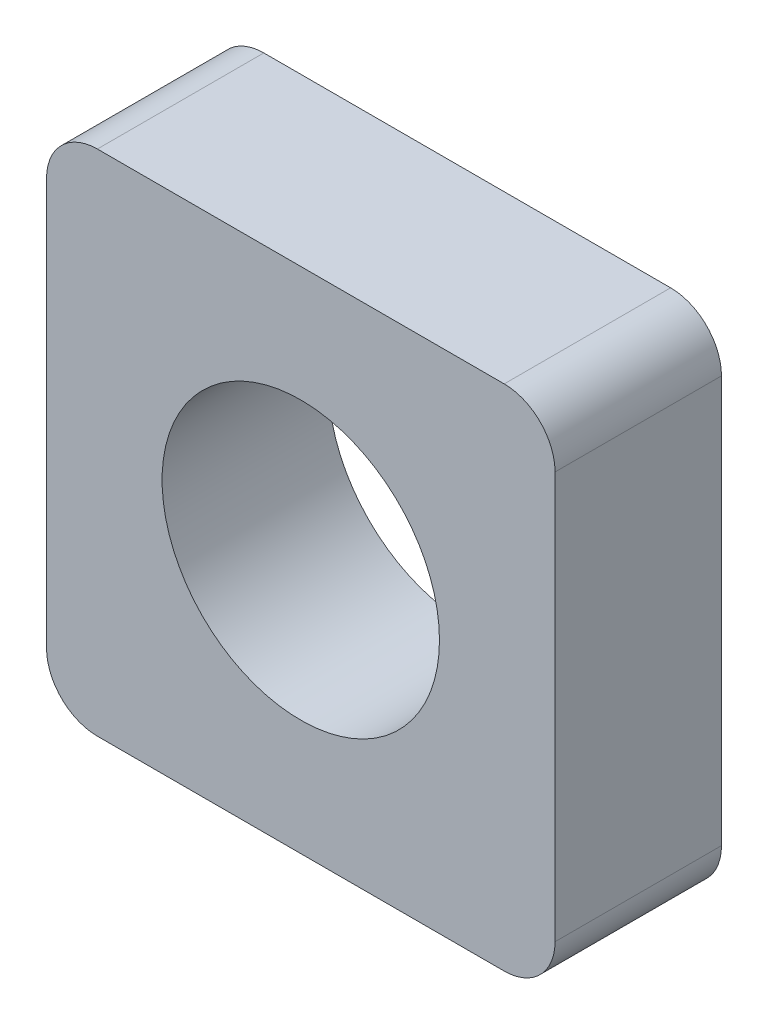
ISO-10303-21;
HEADER;
FILE_DESCRIPTION(('STEP AP214'),'2;1');
FILE_NAME('part.step','',(''),(''),'','','');
FILE_SCHEMA(('AUTOMOTIVE_DESIGN { 1 0 10303 214 1 1 1 1 }'));
ENDSEC;
DATA;
#1=APPLICATION_CONTEXT('core data for automotive mechanical design processes');
#2=APPLICATION_PROTOCOL_DEFINITION('international standard','automotive_design',2000,#1);
#3=PRODUCT_CONTEXT('',#1,'mechanical');
#4=PRODUCT('Part','Part','',(#3));
#5=PRODUCT_RELATED_PRODUCT_CATEGORY('part','',(#4));
#6=PRODUCT_DEFINITION_FORMATION('','',#4);
#7=PRODUCT_DEFINITION_CONTEXT('part definition',#1,'design');
#8=PRODUCT_DEFINITION('design','',#6,#7);
#9=PRODUCT_DEFINITION_SHAPE('','',#8);
#10=(LENGTH_UNIT() NAMED_UNIT(*) SI_UNIT(.MILLI.,.METRE.));
#11=(NAMED_UNIT(*) PLANE_ANGLE_UNIT() SI_UNIT($,.RADIAN.));
#12=(NAMED_UNIT(*) SI_UNIT($,.STERADIAN.) SOLID_ANGLE_UNIT());
#13=UNCERTAINTY_MEASURE_WITH_UNIT(LENGTH_MEASURE(1.E-05),#10,'distance_accuracy_value','');
#14=(GEOMETRIC_REPRESENTATION_CONTEXT(3) GLOBAL_UNCERTAINTY_ASSIGNED_CONTEXT((#13)) GLOBAL_UNIT_ASSIGNED_CONTEXT((#10,
#11,#12)) REPRESENTATION_CONTEXT('',''));
#15=CARTESIAN_POINT('',(0.,0.,0.));
#16=DIRECTION('',(0.,0.,1.));
#17=DIRECTION('',(1.,0.,0.));
#18=AXIS2_PLACEMENT_3D('',#15,#16,#17);
#19=CARTESIAN_POINT('',(0.,0.,1.8));
#20=DIRECTION('',(0.,0.,1.));
#21=DIRECTION('',(1.,0.,0.));
#22=AXIS2_PLACEMENT_3D('',#19,#20,#21);
#23=PLANE('',#22);
#24=DIRECTION('',(0.,-1.,0.));
#25=VECTOR('',#24,1.);
#26=CARTESIAN_POINT('',(-2.75,2.75,1.8));
#27=LINE('',#26,#25);
#28=CARTESIAN_POINT('',(-2.75,2.2,1.8));
#29=VERTEX_POINT('',#28);
#30=CARTESIAN_POINT('',(-2.75,-2.2,1.8));
#31=VERTEX_POINT('',#30);
#32=EDGE_CURVE('E165',#29,#31,#27,.T.);
#33=ORIENTED_EDGE('',*,*,#32,.T.);
#34=CARTESIAN_POINT('',(-2.2,-2.2,1.8));
#35=DIRECTION('',(0.,0.,1.));
#36=DIRECTION('',(1.,0.,0.));
#37=AXIS2_PLACEMENT_3D('',#34,#35,#36);
#38=CIRCLE('',#37,0.55);
#39=CARTESIAN_POINT('',(-2.2,-2.75,1.8));
#40=VERTEX_POINT('',#39);
#41=EDGE_CURVE('E148',#31,#40,#38,.T.);
#42=ORIENTED_EDGE('',*,*,#41,.T.);
#43=DIRECTION('',(1.,0.,0.));
#44=VECTOR('',#43,1.);
#45=CARTESIAN_POINT('',(-2.75,-2.75,1.8));
#46=LINE('',#45,#44);
#47=CARTESIAN_POINT('',(2.2,-2.75,1.8));
#48=VERTEX_POINT('',#47);
#49=EDGE_CURVE('E119',#40,#48,#46,.T.);
#50=ORIENTED_EDGE('',*,*,#49,.T.);
#51=CARTESIAN_POINT('',(2.2,-2.2,1.8));
#52=DIRECTION('',(0.,0.,1.));
#53=DIRECTION('',(1.,0.,0.));
#54=AXIS2_PLACEMENT_3D('',#51,#52,#53);
#55=CIRCLE('',#54,0.55);
#56=CARTESIAN_POINT('',(2.75,-2.2,1.8));
#57=VERTEX_POINT('',#56);
#58=EDGE_CURVE('E146',#48,#57,#55,.T.);
#59=ORIENTED_EDGE('',*,*,#58,.T.);
#60=DIRECTION('',(0.,1.,0.));
#61=VECTOR('',#60,1.);
#62=CARTESIAN_POINT('',(2.75,2.75,1.8));
#63=LINE('',#62,#61);
#64=CARTESIAN_POINT('',(2.75,2.2,1.8));
#65=VERTEX_POINT('',#64);
#66=EDGE_CURVE('E126',#57,#65,#63,.T.);
#67=ORIENTED_EDGE('',*,*,#66,.T.);
#68=CARTESIAN_POINT('',(2.2,2.2,1.8));
#69=DIRECTION('',(0.,0.,1.));
#70=DIRECTION('',(1.,0.,0.));
#71=AXIS2_PLACEMENT_3D('',#68,#69,#70);
#72=CIRCLE('',#71,0.55);
#73=CARTESIAN_POINT('',(2.2,2.75,1.8));
#74=VERTEX_POINT('',#73);
#75=EDGE_CURVE('E54',#65,#74,#72,.T.);
#76=ORIENTED_EDGE('',*,*,#75,.T.);
#77=DIRECTION('',(-1.,0.,0.));
#78=VECTOR('',#77,1.);
#79=CARTESIAN_POINT('',(-2.75,2.75,1.8));
#80=LINE('',#79,#78);
#81=CARTESIAN_POINT('',(-2.2,2.75,1.8));
#82=VERTEX_POINT('',#81);
#83=EDGE_CURVE('E129',#74,#82,#80,.T.);
#84=ORIENTED_EDGE('',*,*,#83,.T.);
#85=CARTESIAN_POINT('',(-2.2,2.2,1.8));
#86=DIRECTION('',(0.,0.,1.));
#87=DIRECTION('',(1.,0.,0.));
#88=AXIS2_PLACEMENT_3D('',#85,#86,#87);
#89=CIRCLE('',#88,0.55);
#90=EDGE_CURVE('E144',#82,#29,#89,.T.);
#91=ORIENTED_EDGE('',*,*,#90,.T.);
#92=EDGE_LOOP('',(#33,#42,#50,#59,#67,#76,#84,#91));
#93=FACE_BOUND('',#92,.T.);
#94=CARTESIAN_POINT('',(0.,0.,1.8));
#95=DIRECTION('',(0.,0.,1.));
#96=DIRECTION('',(1.,0.,0.));
#97=AXIS2_PLACEMENT_3D('',#94,#95,#96);
#98=CIRCLE('',#97,1.5);
#99=CARTESIAN_POINT('',(1.5,0.,1.8));
#100=VERTEX_POINT('',#99);
#101=EDGE_CURVE('E161',#100,#100,#98,.T.);
#102=ORIENTED_EDGE('',*,*,#101,.F.);
#103=EDGE_LOOP('',(#102));
#104=FACE_BOUND('',#103,.T.);
#105=ADVANCED_FACE('F34',(#93,#104),#23,.T.);
#106=CARTESIAN_POINT('',(0.,0.,0.));
#107=DIRECTION('',(0.,0.,1.));
#108=DIRECTION('',(1.,0.,0.));
#109=AXIS2_PLACEMENT_3D('',#106,#107,#108);
#110=PLANE('',#109);
#111=DIRECTION('',(1.,0.,0.));
#112=VECTOR('',#111,1.);
#113=CARTESIAN_POINT('',(-2.75,-2.75,0.));
#114=LINE('',#113,#112);
#115=CARTESIAN_POINT('',(-2.2,-2.75,0.));
#116=VERTEX_POINT('',#115);
#117=CARTESIAN_POINT('',(2.2,-2.75,0.));
#118=VERTEX_POINT('',#117);
#119=EDGE_CURVE('E116',#116,#118,#114,.T.);
#120=ORIENTED_EDGE('',*,*,#119,.F.);
#121=CARTESIAN_POINT('',(-2.2,-2.2,0.));
#122=DIRECTION('',(0.,0.,1.));
#123=DIRECTION('',(1.,0.,0.));
#124=AXIS2_PLACEMENT_3D('',#121,#122,#123);
#125=CIRCLE('',#124,0.55);
#126=CARTESIAN_POINT('',(-2.75,-2.2,0.));
#127=VERTEX_POINT('',#126);
#128=EDGE_CURVE('E99',#116,#127,#125,.F.);
#129=ORIENTED_EDGE('',*,*,#128,.T.);
#130=DIRECTION('',(0.,-1.,0.));
#131=VECTOR('',#130,1.);
#132=CARTESIAN_POINT('',(-2.75,2.75,0.));
#133=LINE('',#132,#131);
#134=CARTESIAN_POINT('',(-2.75,2.2,0.));
#135=VERTEX_POINT('',#134);
#136=EDGE_CURVE('E127',#135,#127,#133,.T.);
#137=ORIENTED_EDGE('',*,*,#136,.F.);
#138=CARTESIAN_POINT('',(-2.2,2.2,0.));
#139=DIRECTION('',(0.,0.,1.));
#140=DIRECTION('',(1.,0.,0.));
#141=AXIS2_PLACEMENT_3D('',#138,#139,#140);
#142=CIRCLE('',#141,0.55);
#143=CARTESIAN_POINT('',(-2.2,2.75,0.));
#144=VERTEX_POINT('',#143);
#145=EDGE_CURVE('E137',#135,#144,#142,.F.);
#146=ORIENTED_EDGE('',*,*,#145,.T.);
#147=DIRECTION('',(-1.,0.,0.));
#148=VECTOR('',#147,1.);
#149=CARTESIAN_POINT('',(-2.75,2.75,0.));
#150=LINE('',#149,#148);
#151=CARTESIAN_POINT('',(2.2,2.75,0.));
#152=VERTEX_POINT('',#151);
#153=EDGE_CURVE('E131',#152,#144,#150,.T.);
#154=ORIENTED_EDGE('',*,*,#153,.F.);
#155=CARTESIAN_POINT('',(2.2,2.2,0.));
#156=DIRECTION('',(0.,0.,1.));
#157=DIRECTION('',(1.,0.,0.));
#158=AXIS2_PLACEMENT_3D('',#155,#156,#157);
#159=CIRCLE('',#158,0.55);
#160=CARTESIAN_POINT('',(2.75,2.2,0.));
#161=VERTEX_POINT('',#160);
#162=EDGE_CURVE('E120',#152,#161,#159,.F.);
#163=ORIENTED_EDGE('',*,*,#162,.T.);
#164=DIRECTION('',(0.,1.,0.));
#165=VECTOR('',#164,1.);
#166=CARTESIAN_POINT('',(2.75,2.75,0.));
#167=LINE('',#166,#165);
#168=CARTESIAN_POINT('',(2.75,-2.2,0.));
#169=VERTEX_POINT('',#168);
#170=EDGE_CURVE('E160',#169,#161,#167,.T.);
#171=ORIENTED_EDGE('',*,*,#170,.F.);
#172=CARTESIAN_POINT('',(2.2,-2.2,0.));
#173=DIRECTION('',(0.,0.,1.));
#174=DIRECTION('',(1.,0.,0.));
#175=AXIS2_PLACEMENT_3D('',#172,#173,#174);
#176=CIRCLE('',#175,0.55);
#177=EDGE_CURVE('E110',#169,#118,#176,.F.);
#178=ORIENTED_EDGE('',*,*,#177,.T.);
#179=EDGE_LOOP('',(#120,#129,#137,#146,#154,#163,#171,#178));
#180=FACE_BOUND('',#179,.T.);
#181=CARTESIAN_POINT('',(0.,0.,0.));
#182=DIRECTION('',(0.,0.,1.));
#183=DIRECTION('',(1.,0.,0.));
#184=AXIS2_PLACEMENT_3D('',#181,#182,#183);
#185=CIRCLE('',#184,1.5);
#186=CARTESIAN_POINT('',(1.5,0.,0.));
#187=VERTEX_POINT('',#186);
#188=EDGE_CURVE('E169',#187,#187,#185,.T.);
#189=ORIENTED_EDGE('',*,*,#188,.T.);
#190=EDGE_LOOP('',(#189));
#191=FACE_BOUND('',#190,.T.);
#192=ADVANCED_FACE('F123',(#180,#191),#110,.F.);
#193=CARTESIAN_POINT('',(2.75,2.75,1.8));
#194=DIRECTION('',(-1.,0.,0.));
#195=DIRECTION('',(0.,-1.,0.));
#196=AXIS2_PLACEMENT_3D('',#193,#194,#195);
#197=PLANE('',#196);
#198=ORIENTED_EDGE('',*,*,#66,.F.);
#199=DIRECTION('',(0.,0.,-1.));
#200=VECTOR('',#199,1.);
#201=CARTESIAN_POINT('',(2.75,-2.2,1.8));
#202=LINE('',#201,#200);
#203=EDGE_CURVE('E152',#57,#169,#202,.T.);
#204=ORIENTED_EDGE('',*,*,#203,.T.);
#205=ORIENTED_EDGE('',*,*,#170,.T.);
#206=DIRECTION('',(0.,0.,-1.));
#207=VECTOR('',#206,1.);
#208=CARTESIAN_POINT('',(2.75,2.2,1.8));
#209=LINE('',#208,#207);
#210=EDGE_CURVE('E150',#161,#65,#209,.F.);
#211=ORIENTED_EDGE('',*,*,#210,.T.);
#212=EDGE_LOOP('',(#198,#204,#205,#211));
#213=FACE_BOUND('',#212,.T.);
#214=ADVANCED_FACE('F183',(#213),#197,.F.);
#215=CARTESIAN_POINT('',(-2.75,2.75,1.8));
#216=DIRECTION('',(0.,-1.,0.));
#217=DIRECTION('',(0.,0.,-1.));
#218=AXIS2_PLACEMENT_3D('',#215,#216,#217);
#219=PLANE('',#218);
#220=ORIENTED_EDGE('',*,*,#153,.T.);
#221=DIRECTION('',(0.,0.,-1.));
#222=VECTOR('',#221,1.);
#223=CARTESIAN_POINT('',(-2.2,2.75,1.8));
#224=LINE('',#223,#222);
#225=EDGE_CURVE('E11',#144,#82,#224,.F.);
#226=ORIENTED_EDGE('',*,*,#225,.T.);
#227=ORIENTED_EDGE('',*,*,#83,.F.);
#228=DIRECTION('',(0.,0.,-1.));
#229=VECTOR('',#228,1.);
#230=CARTESIAN_POINT('',(2.2,2.75,1.8));
#231=LINE('',#230,#229);
#232=EDGE_CURVE('E42',#74,#152,#231,.T.);
#233=ORIENTED_EDGE('',*,*,#232,.T.);
#234=EDGE_LOOP('',(#220,#226,#227,#233));
#235=FACE_BOUND('',#234,.T.);
#236=ADVANCED_FACE('F157',(#235),#219,.F.);
#237=CARTESIAN_POINT('',(-2.75,2.75,1.8));
#238=DIRECTION('',(1.,0.,0.));
#239=DIRECTION('',(0.,1.,0.));
#240=AXIS2_PLACEMENT_3D('',#237,#238,#239);
#241=PLANE('',#240);
#242=ORIENTED_EDGE('',*,*,#136,.T.);
#243=DIRECTION('',(0.,0.,-1.));
#244=VECTOR('',#243,1.);
#245=CARTESIAN_POINT('',(-2.75,-2.2,1.8));
#246=LINE('',#245,#244);
#247=EDGE_CURVE('E104',#127,#31,#246,.F.);
#248=ORIENTED_EDGE('',*,*,#247,.T.);
#249=ORIENTED_EDGE('',*,*,#32,.F.);
#250=DIRECTION('',(0.,0.,-1.));
#251=VECTOR('',#250,1.);
#252=CARTESIAN_POINT('',(-2.75,2.2,1.8));
#253=LINE('',#252,#251);
#254=EDGE_CURVE('E109',#29,#135,#253,.T.);
#255=ORIENTED_EDGE('',*,*,#254,.T.);
#256=EDGE_LOOP('',(#242,#248,#249,#255));
#257=FACE_BOUND('',#256,.T.);
#258=ADVANCED_FACE('F189',(#257),#241,.F.);
#259=CARTESIAN_POINT('',(-2.75,-2.75,1.8));
#260=DIRECTION('',(0.,1.,0.));
#261=DIRECTION('',(0.,0.,1.));
#262=AXIS2_PLACEMENT_3D('',#259,#260,#261);
#263=PLANE('',#262);
#264=ORIENTED_EDGE('',*,*,#49,.F.);
#265=DIRECTION('',(0.,0.,-1.));
#266=VECTOR('',#265,1.);
#267=CARTESIAN_POINT('',(-2.2,-2.75,1.8));
#268=LINE('',#267,#266);
#269=EDGE_CURVE('E103',#40,#116,#268,.T.);
#270=ORIENTED_EDGE('',*,*,#269,.T.);
#271=ORIENTED_EDGE('',*,*,#119,.T.);
#272=DIRECTION('',(0.,0.,-1.));
#273=VECTOR('',#272,1.);
#274=CARTESIAN_POINT('',(2.2,-2.75,1.8));
#275=LINE('',#274,#273);
#276=EDGE_CURVE('E121',#118,#48,#275,.F.);
#277=ORIENTED_EDGE('',*,*,#276,.T.);
#278=EDGE_LOOP('',(#264,#270,#271,#277));
#279=FACE_BOUND('',#278,.T.);
#280=ADVANCED_FACE('F115',(#279),#263,.F.);
#281=CARTESIAN_POINT('',(0.,0.,1.8));
#282=DIRECTION('',(0.,0.,-1.));
#283=DIRECTION('',(-1.,0.,0.));
#284=AXIS2_PLACEMENT_3D('',#281,#282,#283);
#285=CYLINDRICAL_SURFACE('',#284,1.5);
#286=ORIENTED_EDGE('',*,*,#101,.T.);
#287=EDGE_LOOP('',(#286));
#288=FACE_BOUND('',#287,.T.);
#289=ORIENTED_EDGE('',*,*,#188,.F.);
#290=EDGE_LOOP('',(#289));
#291=FACE_BOUND('',#290,.T.);
#292=ADVANCED_FACE('F175',(#288,#291),#285,.F.);
#293=CARTESIAN_POINT('',(-2.2,-2.2,1.8));
#294=DIRECTION('',(0.,0.,-1.));
#295=DIRECTION('',(-1.,0.,0.));
#296=AXIS2_PLACEMENT_3D('',#293,#294,#295);
#297=CYLINDRICAL_SURFACE('',#296,0.55);
#298=ORIENTED_EDGE('',*,*,#41,.F.);
#299=ORIENTED_EDGE('',*,*,#247,.F.);
#300=ORIENTED_EDGE('',*,*,#128,.F.);
#301=ORIENTED_EDGE('',*,*,#269,.F.);
#302=EDGE_LOOP('',(#298,#299,#300,#301));
#303=FACE_BOUND('',#302,.T.);
#304=ADVANCED_FACE('F102',(#303),#297,.T.);
#305=CARTESIAN_POINT('',(2.2,-2.2,1.8));
#306=DIRECTION('',(0.,0.,-1.));
#307=DIRECTION('',(-1.,0.,0.));
#308=AXIS2_PLACEMENT_3D('',#305,#306,#307);
#309=CYLINDRICAL_SURFACE('',#308,0.55);
#310=ORIENTED_EDGE('',*,*,#58,.F.);
#311=ORIENTED_EDGE('',*,*,#276,.F.);
#312=ORIENTED_EDGE('',*,*,#177,.F.);
#313=ORIENTED_EDGE('',*,*,#203,.F.);
#314=EDGE_LOOP('',(#310,#311,#312,#313));
#315=FACE_BOUND('',#314,.T.);
#316=ADVANCED_FACE('F200',(#315),#309,.T.);
#317=CARTESIAN_POINT('',(-2.2,2.2,1.8));
#318=DIRECTION('',(0.,0.,-1.));
#319=DIRECTION('',(-1.,0.,0.));
#320=AXIS2_PLACEMENT_3D('',#317,#318,#319);
#321=CYLINDRICAL_SURFACE('',#320,0.55);
#322=ORIENTED_EDGE('',*,*,#90,.F.);
#323=ORIENTED_EDGE('',*,*,#225,.F.);
#324=ORIENTED_EDGE('',*,*,#145,.F.);
#325=ORIENTED_EDGE('',*,*,#254,.F.);
#326=EDGE_LOOP('',(#322,#323,#324,#325));
#327=FACE_BOUND('',#326,.T.);
#328=ADVANCED_FACE('F202',(#327),#321,.T.);
#329=CARTESIAN_POINT('',(2.2,2.2,1.8));
#330=DIRECTION('',(0.,0.,-1.));
#331=DIRECTION('',(-1.,0.,0.));
#332=AXIS2_PLACEMENT_3D('',#329,#330,#331);
#333=CYLINDRICAL_SURFACE('',#332,0.55);
#334=ORIENTED_EDGE('',*,*,#75,.F.);
#335=ORIENTED_EDGE('',*,*,#210,.F.);
#336=ORIENTED_EDGE('',*,*,#162,.F.);
#337=ORIENTED_EDGE('',*,*,#232,.F.);
#338=EDGE_LOOP('',(#334,#335,#336,#337));
#339=FACE_BOUND('',#338,.T.);
#340=ADVANCED_FACE('F36',(#339),#333,.T.);
#341=CLOSED_SHELL('',(#105,#192,#214,#236,#258,#280,#292,#304,#316,#328,#340));
#342=MANIFOLD_SOLID_BREP('B2',#341);
#343=ADVANCED_BREP_SHAPE_REPRESENTATION('',(#18,#342),#14);
#344=SHAPE_DEFINITION_REPRESENTATION(#9,#343);
ENDSEC;
END-ISO-10303-21;
